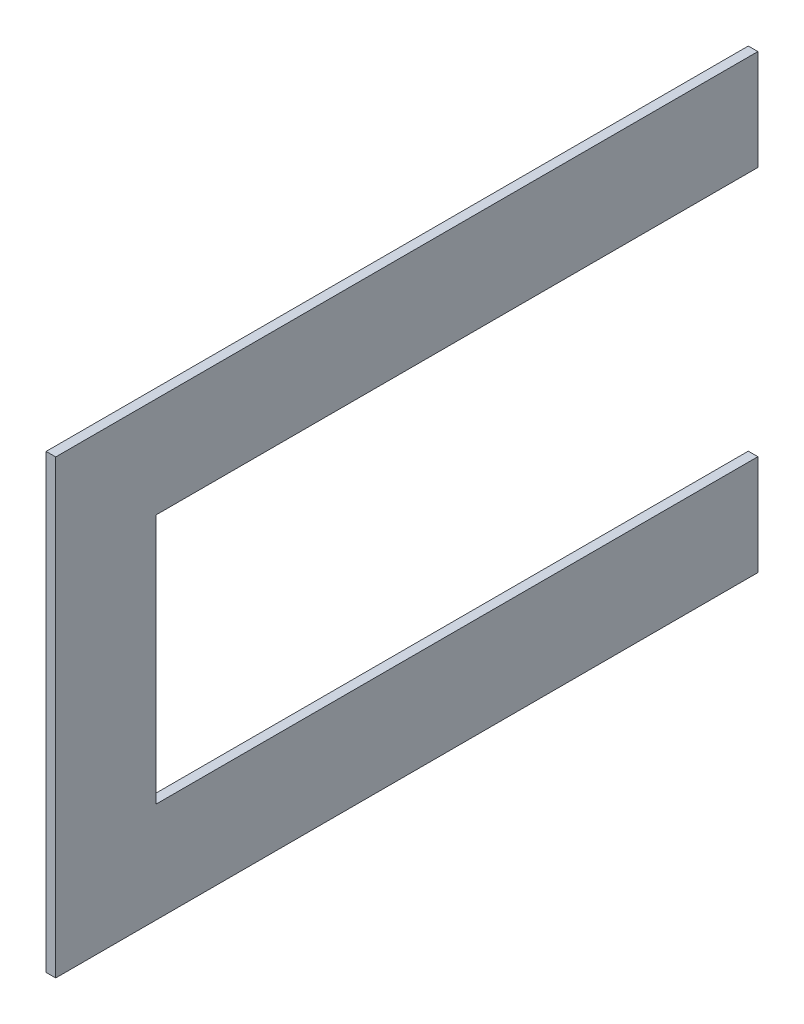
ISO-10303-21;
HEADER;
FILE_DESCRIPTION(('STEP AP214'),'2;1');
FILE_NAME('part.step','',(''),(''),'','','');
FILE_SCHEMA(('AUTOMOTIVE_DESIGN { 1 0 10303 214 1 1 1 1 }'));
ENDSEC;
DATA;
#1=APPLICATION_CONTEXT('core data for automotive mechanical design processes');
#2=APPLICATION_PROTOCOL_DEFINITION('international standard','automotive_design',2000,#1);
#3=PRODUCT_CONTEXT('',#1,'mechanical');
#4=PRODUCT('Part','Part','',(#3));
#5=PRODUCT_RELATED_PRODUCT_CATEGORY('part','',(#4));
#6=PRODUCT_DEFINITION_FORMATION('','',#4);
#7=PRODUCT_DEFINITION_CONTEXT('part definition',#1,'design');
#8=PRODUCT_DEFINITION('design','',#6,#7);
#9=PRODUCT_DEFINITION_SHAPE('','',#8);
#10=(LENGTH_UNIT() NAMED_UNIT(*) SI_UNIT(.MILLI.,.METRE.));
#11=(NAMED_UNIT(*) PLANE_ANGLE_UNIT() SI_UNIT($,.RADIAN.));
#12=(NAMED_UNIT(*) SI_UNIT($,.STERADIAN.) SOLID_ANGLE_UNIT());
#13=UNCERTAINTY_MEASURE_WITH_UNIT(LENGTH_MEASURE(1.E-05),#10,'distance_accuracy_value','');
#14=(GEOMETRIC_REPRESENTATION_CONTEXT(3) GLOBAL_UNCERTAINTY_ASSIGNED_CONTEXT((#13)) GLOBAL_UNIT_ASSIGNED_CONTEXT((#10,
#11,#12)) REPRESENTATION_CONTEXT('',''));
#15=CARTESIAN_POINT('',(0.,0.,0.));
#16=DIRECTION('',(0.,0.,1.));
#17=DIRECTION('',(1.,0.,0.));
#18=AXIS2_PLACEMENT_3D('',#15,#16,#17);
#19=CARTESIAN_POINT('',(1.8288,0.,50.3309363821514));
#20=DIRECTION('',(0.,0.,-1.));
#21=DIRECTION('',(0.,1.,0.));
#22=AXIS2_PLACEMENT_3D('',#19,#20,#21);
#23=PLANE('',#22);
#24=DIRECTION('',(0.,-1.,0.));
#25=VECTOR('',#24,1.);
#26=CARTESIAN_POINT('',(0.,0.,50.3309363821514));
#27=LINE('',#26,#25);
#28=CARTESIAN_POINT('',(0.,41.6287132603223,50.3309363821514));
#29=VERTEX_POINT('',#28);
#30=CARTESIAN_POINT('',(0.,-44.4518867396777,50.3309363821514));
#31=VERTEX_POINT('',#30);
#32=EDGE_CURVE('E132',#29,#31,#27,.T.);
#33=ORIENTED_EDGE('',*,*,#32,.T.);
#34=DIRECTION('',(-1.,0.,0.));
#35=VECTOR('',#34,1.);
#36=CARTESIAN_POINT('',(1.8288,-44.4518867396777,50.3309363821514));
#37=LINE('',#36,#35);
#38=CARTESIAN_POINT('',(1.8288,-44.4518867396777,50.3309363821514));
#39=VERTEX_POINT('',#38);
#40=EDGE_CURVE('E11',#39,#31,#37,.T.);
#41=ORIENTED_EDGE('',*,*,#40,.F.);
#42=DIRECTION('',(0.,-1.,0.));
#43=VECTOR('',#42,1.);
#44=CARTESIAN_POINT('',(1.8288,0.,50.3309363821514));
#45=LINE('',#44,#43);
#46=CARTESIAN_POINT('',(1.8288,41.6287132603223,50.3309363821514));
#47=VERTEX_POINT('',#46);
#48=EDGE_CURVE('E151',#47,#39,#45,.T.);
#49=ORIENTED_EDGE('',*,*,#48,.F.);
#50=DIRECTION('',(-1.,0.,0.));
#51=VECTOR('',#50,1.);
#52=CARTESIAN_POINT('',(1.8288,41.6287132603223,50.3309363821514));
#53=LINE('',#52,#51);
#54=EDGE_CURVE('E50',#47,#29,#53,.T.);
#55=ORIENTED_EDGE('',*,*,#54,.T.);
#56=EDGE_LOOP('',(#33,#41,#49,#55));
#57=FACE_BOUND('',#56,.T.);
#58=ADVANCED_FACE('F34',(#57),#23,.F.);
#59=CARTESIAN_POINT('',(1.8288,-44.4518867396777,0.));
#60=DIRECTION('',(0.,1.,0.));
#61=DIRECTION('',(0.,0.,1.));
#62=AXIS2_PLACEMENT_3D('',#59,#60,#61);
#63=PLANE('',#62);
#64=DIRECTION('',(0.,0.,-1.));
#65=VECTOR('',#64,1.);
#66=CARTESIAN_POINT('',(0.,-44.4518867396777,0.));
#67=LINE('',#66,#65);
#68=CARTESIAN_POINT('',(0.,-44.4518867396777,-83.6159636178486));
#69=VERTEX_POINT('',#68);
#70=EDGE_CURVE('E134',#31,#69,#67,.T.);
#71=ORIENTED_EDGE('',*,*,#70,.T.);
#72=DIRECTION('',(-1.,0.,0.));
#73=VECTOR('',#72,1.);
#74=CARTESIAN_POINT('',(1.8288,-44.4518867396777,-83.6159636178486));
#75=LINE('',#74,#73);
#76=CARTESIAN_POINT('',(1.8288,-44.4518867396777,-83.6159636178486));
#77=VERTEX_POINT('',#76);
#78=EDGE_CURVE('E42',#77,#69,#75,.T.);
#79=ORIENTED_EDGE('',*,*,#78,.F.);
#80=DIRECTION('',(0.,0.,-1.));
#81=VECTOR('',#80,1.);
#82=CARTESIAN_POINT('',(1.8288,-44.4518867396777,0.));
#83=LINE('',#82,#81);
#84=EDGE_CURVE('E88',#39,#77,#83,.T.);
#85=ORIENTED_EDGE('',*,*,#84,.F.);
#86=ORIENTED_EDGE('',*,*,#40,.T.);
#87=EDGE_LOOP('',(#71,#79,#85,#86));
#88=FACE_BOUND('',#87,.T.);
#89=ADVANCED_FACE('F164',(#88),#63,.F.);
#90=CARTESIAN_POINT('',(1.8288,0.,-83.6159636178486));
#91=DIRECTION('',(0.,0.,-1.));
#92=DIRECTION('',(0.,1.,0.));
#93=AXIS2_PLACEMENT_3D('',#90,#91,#92);
#94=PLANE('',#93);
#95=DIRECTION('',(0.,-1.,0.));
#96=VECTOR('',#95,1.);
#97=CARTESIAN_POINT('',(0.,0.,-83.6159636178486));
#98=LINE('',#97,#96);
#99=CARTESIAN_POINT('',(0.,-25.3002867396777,-83.6159636178486));
#100=VERTEX_POINT('',#99);
#101=EDGE_CURVE('E137',#100,#69,#98,.T.);
#102=ORIENTED_EDGE('',*,*,#101,.F.);
#103=DIRECTION('',(-1.,0.,0.));
#104=VECTOR('',#103,1.);
#105=CARTESIAN_POINT('',(1.8288,-25.3002867396777,-83.6159636178486));
#106=LINE('',#105,#104);
#107=CARTESIAN_POINT('',(1.8288,-25.3002867396777,-83.6159636178486));
#108=VERTEX_POINT('',#107);
#109=EDGE_CURVE('E157',#108,#100,#106,.T.);
#110=ORIENTED_EDGE('',*,*,#109,.F.);
#111=DIRECTION('',(0.,-1.,0.));
#112=VECTOR('',#111,1.);
#113=CARTESIAN_POINT('',(1.8288,0.,-83.6159636178486));
#114=LINE('',#113,#112);
#115=EDGE_CURVE('E163',#108,#77,#114,.T.);
#116=ORIENTED_EDGE('',*,*,#115,.T.);
#117=ORIENTED_EDGE('',*,*,#78,.T.);
#118=EDGE_LOOP('',(#102,#110,#116,#117));
#119=FACE_BOUND('',#118,.T.);
#120=ADVANCED_FACE('F161',(#119),#94,.T.);
#121=CARTESIAN_POINT('',(1.8288,-25.3002867396777,0.));
#122=DIRECTION('',(0.,1.,0.));
#123=DIRECTION('',(0.,0.,1.));
#124=AXIS2_PLACEMENT_3D('',#121,#122,#123);
#125=PLANE('',#124);
#126=DIRECTION('',(0.,0.,-1.));
#127=VECTOR('',#126,1.);
#128=CARTESIAN_POINT('',(0.,-25.3002867396777,0.));
#129=LINE('',#128,#127);
#130=CARTESIAN_POINT('',(0.,-25.3002867396777,31.1793363821514));
#131=VERTEX_POINT('',#130);
#132=EDGE_CURVE('E140',#131,#100,#129,.T.);
#133=ORIENTED_EDGE('',*,*,#132,.F.);
#134=DIRECTION('',(-1.,0.,0.));
#135=VECTOR('',#134,1.);
#136=CARTESIAN_POINT('',(1.8288,-25.3002867396777,31.1793363821514));
#137=LINE('',#136,#135);
#138=CARTESIAN_POINT('',(1.8288,-25.3002867396777,31.1793363821514));
#139=VERTEX_POINT('',#138);
#140=EDGE_CURVE('E155',#139,#131,#137,.T.);
#141=ORIENTED_EDGE('',*,*,#140,.F.);
#142=DIRECTION('',(0.,0.,-1.));
#143=VECTOR('',#142,1.);
#144=CARTESIAN_POINT('',(1.8288,-25.3002867396777,0.));
#145=LINE('',#144,#143);
#146=EDGE_CURVE('E173',#139,#108,#145,.T.);
#147=ORIENTED_EDGE('',*,*,#146,.T.);
#148=ORIENTED_EDGE('',*,*,#109,.T.);
#149=EDGE_LOOP('',(#133,#141,#147,#148));
#150=FACE_BOUND('',#149,.T.);
#151=ADVANCED_FACE('F171',(#150),#125,.T.);
#152=CARTESIAN_POINT('',(1.8288,0.,31.1793363821514));
#153=DIRECTION('',(0.,0.,1.));
#154=DIRECTION('',(1.,0.,0.));
#155=AXIS2_PLACEMENT_3D('',#152,#153,#154);
#156=PLANE('',#155);
#157=DIRECTION('',(0.,1.,0.));
#158=VECTOR('',#157,1.);
#159=CARTESIAN_POINT('',(0.,0.,31.1793363821514));
#160=LINE('',#159,#158);
#161=CARTESIAN_POINT('',(0.,22.4771132603222,31.1793363821514));
#162=VERTEX_POINT('',#161);
#163=EDGE_CURVE('E143',#131,#162,#160,.T.);
#164=ORIENTED_EDGE('',*,*,#163,.T.);
#165=DIRECTION('',(-1.,0.,0.));
#166=VECTOR('',#165,1.);
#167=CARTESIAN_POINT('',(1.8288,22.4771132603222,31.1793363821514));
#168=LINE('',#167,#166);
#169=CARTESIAN_POINT('',(1.8288,22.4771132603222,31.1793363821514));
#170=VERTEX_POINT('',#169);
#171=EDGE_CURVE('E124',#170,#162,#168,.T.);
#172=ORIENTED_EDGE('',*,*,#171,.F.);
#173=DIRECTION('',(0.,1.,0.));
#174=VECTOR('',#173,1.);
#175=CARTESIAN_POINT('',(1.8288,0.,31.1793363821514));
#176=LINE('',#175,#174);
#177=EDGE_CURVE('E112',#139,#170,#176,.T.);
#178=ORIENTED_EDGE('',*,*,#177,.F.);
#179=ORIENTED_EDGE('',*,*,#140,.T.);
#180=EDGE_LOOP('',(#164,#172,#178,#179));
#181=FACE_BOUND('',#180,.T.);
#182=ADVANCED_FACE('F199',(#181),#156,.F.);
#183=CARTESIAN_POINT('',(1.8288,22.4771132603222,0.));
#184=DIRECTION('',(0.,1.,0.));
#185=DIRECTION('',(0.,0.,1.));
#186=AXIS2_PLACEMENT_3D('',#183,#184,#185);
#187=PLANE('',#186);
#188=DIRECTION('',(0.,0.,-1.));
#189=VECTOR('',#188,1.);
#190=CARTESIAN_POINT('',(0.,22.4771132603222,0.));
#191=LINE('',#190,#189);
#192=CARTESIAN_POINT('',(0.,22.4771132603222,-83.6159636178486));
#193=VERTEX_POINT('',#192);
#194=EDGE_CURVE('E121',#162,#193,#191,.T.);
#195=ORIENTED_EDGE('',*,*,#194,.T.);
#196=DIRECTION('',(-1.,0.,0.));
#197=VECTOR('',#196,1.);
#198=CARTESIAN_POINT('',(1.8288,22.4771132603222,-83.6159636178486));
#199=LINE('',#198,#197);
#200=CARTESIAN_POINT('',(1.8288,22.4771132603222,-83.6159636178486));
#201=VERTEX_POINT('',#200);
#202=EDGE_CURVE('E118',#201,#193,#199,.T.);
#203=ORIENTED_EDGE('',*,*,#202,.F.);
#204=DIRECTION('',(0.,0.,-1.));
#205=VECTOR('',#204,1.);
#206=CARTESIAN_POINT('',(1.8288,22.4771132603222,0.));
#207=LINE('',#206,#205);
#208=EDGE_CURVE('E104',#170,#201,#207,.T.);
#209=ORIENTED_EDGE('',*,*,#208,.F.);
#210=ORIENTED_EDGE('',*,*,#171,.T.);
#211=EDGE_LOOP('',(#195,#203,#209,#210));
#212=FACE_BOUND('',#211,.T.);
#213=ADVANCED_FACE('F119',(#212),#187,.F.);
#214=CARTESIAN_POINT('',(1.8288,0.,-83.6159636178486));
#215=DIRECTION('',(0.,0.,-1.));
#216=DIRECTION('',(0.,1.,0.));
#217=AXIS2_PLACEMENT_3D('',#214,#215,#216);
#218=PLANE('',#217);
#219=DIRECTION('',(0.,-1.,0.));
#220=VECTOR('',#219,1.);
#221=CARTESIAN_POINT('',(0.,0.,-83.6159636178486));
#222=LINE('',#221,#220);
#223=CARTESIAN_POINT('',(0.,41.6287132603223,-83.6159636178486));
#224=VERTEX_POINT('',#223);
#225=EDGE_CURVE('E146',#224,#193,#222,.T.);
#226=ORIENTED_EDGE('',*,*,#225,.F.);
#227=DIRECTION('',(-1.,0.,0.));
#228=VECTOR('',#227,1.);
#229=CARTESIAN_POINT('',(1.8288,41.6287132603223,-83.6159636178486));
#230=LINE('',#229,#228);
#231=CARTESIAN_POINT('',(1.8288,41.6287132603223,-83.6159636178486));
#232=VERTEX_POINT('',#231);
#233=EDGE_CURVE('E76',#232,#224,#230,.T.);
#234=ORIENTED_EDGE('',*,*,#233,.F.);
#235=DIRECTION('',(0.,-1.,0.));
#236=VECTOR('',#235,1.);
#237=CARTESIAN_POINT('',(1.8288,0.,-83.6159636178486));
#238=LINE('',#237,#236);
#239=EDGE_CURVE('E109',#232,#201,#238,.T.);
#240=ORIENTED_EDGE('',*,*,#239,.T.);
#241=ORIENTED_EDGE('',*,*,#202,.T.);
#242=EDGE_LOOP('',(#226,#234,#240,#241));
#243=FACE_BOUND('',#242,.T.);
#244=ADVANCED_FACE('F126',(#243),#218,.T.);
#245=CARTESIAN_POINT('',(1.8288,41.6287132603223,0.));
#246=DIRECTION('',(0.,1.,0.));
#247=DIRECTION('',(0.,0.,1.));
#248=AXIS2_PLACEMENT_3D('',#245,#246,#247);
#249=PLANE('',#248);
#250=DIRECTION('',(0.,0.,-1.));
#251=VECTOR('',#250,1.);
#252=CARTESIAN_POINT('',(0.,41.6287132603223,0.));
#253=LINE('',#252,#251);
#254=EDGE_CURVE('E148',#29,#224,#253,.T.);
#255=ORIENTED_EDGE('',*,*,#254,.F.);
#256=ORIENTED_EDGE('',*,*,#54,.F.);
#257=DIRECTION('',(0.,0.,-1.));
#258=VECTOR('',#257,1.);
#259=CARTESIAN_POINT('',(1.8288,41.6287132603223,0.));
#260=LINE('',#259,#258);
#261=EDGE_CURVE('E127',#47,#232,#260,.T.);
#262=ORIENTED_EDGE('',*,*,#261,.T.);
#263=ORIENTED_EDGE('',*,*,#233,.T.);
#264=EDGE_LOOP('',(#255,#256,#262,#263));
#265=FACE_BOUND('',#264,.T.);
#266=ADVANCED_FACE('F178',(#265),#249,.T.);
#267=CARTESIAN_POINT('',(1.8288,0.,0.));
#268=DIRECTION('',(1.,0.,0.));
#269=DIRECTION('',(0.,0.,-1.));
#270=AXIS2_PLACEMENT_3D('',#267,#268,#269);
#271=PLANE('',#270);
#272=ORIENTED_EDGE('',*,*,#48,.T.);
#273=ORIENTED_EDGE('',*,*,#84,.T.);
#274=ORIENTED_EDGE('',*,*,#115,.F.);
#275=ORIENTED_EDGE('',*,*,#146,.F.);
#276=ORIENTED_EDGE('',*,*,#177,.T.);
#277=ORIENTED_EDGE('',*,*,#208,.T.);
#278=ORIENTED_EDGE('',*,*,#239,.F.);
#279=ORIENTED_EDGE('',*,*,#261,.F.);
#280=EDGE_LOOP('',(#272,#273,#274,#275,#276,#277,#278,#279));
#281=FACE_BOUND('',#280,.T.);
#282=ADVANCED_FACE('F106',(#281),#271,.T.);
#283=CARTESIAN_POINT('',(0.,0.,0.));
#284=DIRECTION('',(1.,0.,0.));
#285=DIRECTION('',(0.,0.,-1.));
#286=AXIS2_PLACEMENT_3D('',#283,#284,#285);
#287=PLANE('',#286);
#288=ORIENTED_EDGE('',*,*,#32,.F.);
#289=ORIENTED_EDGE('',*,*,#254,.T.);
#290=ORIENTED_EDGE('',*,*,#225,.T.);
#291=ORIENTED_EDGE('',*,*,#194,.F.);
#292=ORIENTED_EDGE('',*,*,#163,.F.);
#293=ORIENTED_EDGE('',*,*,#132,.T.);
#294=ORIENTED_EDGE('',*,*,#101,.T.);
#295=ORIENTED_EDGE('',*,*,#70,.F.);
#296=EDGE_LOOP('',(#288,#289,#290,#291,#292,#293,#294,#295));
#297=FACE_BOUND('',#296,.T.);
#298=ADVANCED_FACE('F167',(#297),#287,.F.);
#299=CLOSED_SHELL('',(#58,#89,#120,#151,#182,#213,#244,#266,#282,#298));
#300=MANIFOLD_SOLID_BREP('B2',#299);
#301=ADVANCED_BREP_SHAPE_REPRESENTATION('',(#18,#300),#14);
#302=SHAPE_DEFINITION_REPRESENTATION(#9,#301);
ENDSEC;
END-ISO-10303-21;
